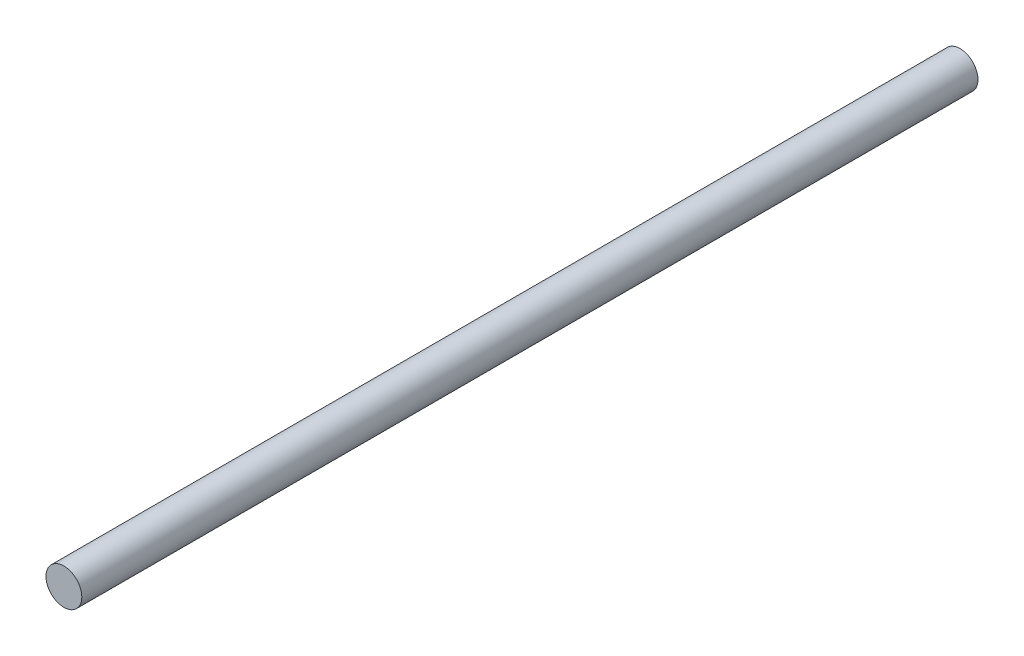
ISO-10303-21;
HEADER;
FILE_DESCRIPTION(('STEP AP214'),'2;1');
FILE_NAME('part.step','',(''),(''),'','','');
FILE_SCHEMA(('AUTOMOTIVE_DESIGN { 1 0 10303 214 1 1 1 1 }'));
ENDSEC;
DATA;
#1=APPLICATION_CONTEXT('core data for automotive mechanical design processes');
#2=APPLICATION_PROTOCOL_DEFINITION('international standard','automotive_design',2000,#1);
#3=PRODUCT_CONTEXT('',#1,'mechanical');
#4=PRODUCT('Part','Part','',(#3));
#5=PRODUCT_RELATED_PRODUCT_CATEGORY('part','',(#4));
#6=PRODUCT_DEFINITION_FORMATION('','',#4);
#7=PRODUCT_DEFINITION_CONTEXT('part definition',#1,'design');
#8=PRODUCT_DEFINITION('design','',#6,#7);
#9=PRODUCT_DEFINITION_SHAPE('','',#8);
#10=(LENGTH_UNIT() NAMED_UNIT(*) SI_UNIT(.MILLI.,.METRE.));
#11=(NAMED_UNIT(*) PLANE_ANGLE_UNIT() SI_UNIT($,.RADIAN.));
#12=(NAMED_UNIT(*) SI_UNIT($,.STERADIAN.) SOLID_ANGLE_UNIT());
#13=UNCERTAINTY_MEASURE_WITH_UNIT(LENGTH_MEASURE(1.E-05),#10,'distance_accuracy_value','');
#14=(GEOMETRIC_REPRESENTATION_CONTEXT(3) GLOBAL_UNCERTAINTY_ASSIGNED_CONTEXT((#13)) GLOBAL_UNIT_ASSIGNED_CONTEXT((#10,
#11,#12)) REPRESENTATION_CONTEXT('',''));
#15=CARTESIAN_POINT('',(0.,0.,0.));
#16=DIRECTION('',(0.,0.,1.));
#17=DIRECTION('',(1.,0.,0.));
#18=AXIS2_PLACEMENT_3D('',#15,#16,#17);
#19=CARTESIAN_POINT('',(0.,0.,250.));
#20=DIRECTION('',(0.,0.,-1.));
#21=DIRECTION('',(-1.,0.,0.));
#22=AXIS2_PLACEMENT_3D('',#19,#20,#21);
#23=CYLINDRICAL_SURFACE('',#22,10.);
#24=CARTESIAN_POINT('',(0.,0.,250.));
#25=DIRECTION('',(0.,0.,1.));
#26=DIRECTION('',(1.,0.,0.));
#27=AXIS2_PLACEMENT_3D('',#24,#25,#26);
#28=CIRCLE('',#27,10.);
#29=CARTESIAN_POINT('',(10.,0.,250.));
#30=VERTEX_POINT('',#29);
#31=EDGE_CURVE('E10',#30,#30,#28,.T.);
#32=ORIENTED_EDGE('',*,*,#31,.F.);
#33=EDGE_LOOP('',(#32));
#34=FACE_BOUND('',#33,.T.);
#35=CARTESIAN_POINT('',(0.,0.,-250.));
#36=DIRECTION('',(0.,0.,1.));
#37=DIRECTION('',(1.,0.,0.));
#38=AXIS2_PLACEMENT_3D('',#35,#36,#37);
#39=CIRCLE('',#38,10.);
#40=CARTESIAN_POINT('',(10.,0.,-250.));
#41=VERTEX_POINT('',#40);
#42=EDGE_CURVE('E38',#41,#41,#39,.T.);
#43=ORIENTED_EDGE('',*,*,#42,.T.);
#44=EDGE_LOOP('',(#43));
#45=FACE_BOUND('',#44,.T.);
#46=ADVANCED_FACE('F35',(#34,#45),#23,.T.);
#47=CARTESIAN_POINT('',(0.,0.,250.));
#48=DIRECTION('',(0.,0.,1.));
#49=DIRECTION('',(1.,0.,0.));
#50=AXIS2_PLACEMENT_3D('',#47,#48,#49);
#51=PLANE('',#50);
#52=ORIENTED_EDGE('',*,*,#31,.T.);
#53=EDGE_LOOP('',(#52));
#54=FACE_BOUND('',#53,.T.);
#55=ADVANCED_FACE('F50',(#54),#51,.T.);
#56=CARTESIAN_POINT('',(0.,0.,-250.));
#57=DIRECTION('',(0.,0.,1.));
#58=DIRECTION('',(1.,0.,0.));
#59=AXIS2_PLACEMENT_3D('',#56,#57,#58);
#60=PLANE('',#59);
#61=ORIENTED_EDGE('',*,*,#42,.F.);
#62=EDGE_LOOP('',(#61));
#63=FACE_BOUND('',#62,.T.);
#64=ADVANCED_FACE('F48',(#63),#60,.F.);
#65=CLOSED_SHELL('',(#46,#55,#64));
#66=MANIFOLD_SOLID_BREP('B2',#65);
#67=ADVANCED_BREP_SHAPE_REPRESENTATION('',(#18,#66),#14);
#68=SHAPE_DEFINITION_REPRESENTATION(#9,#67);
ENDSEC;
END-ISO-10303-21;
